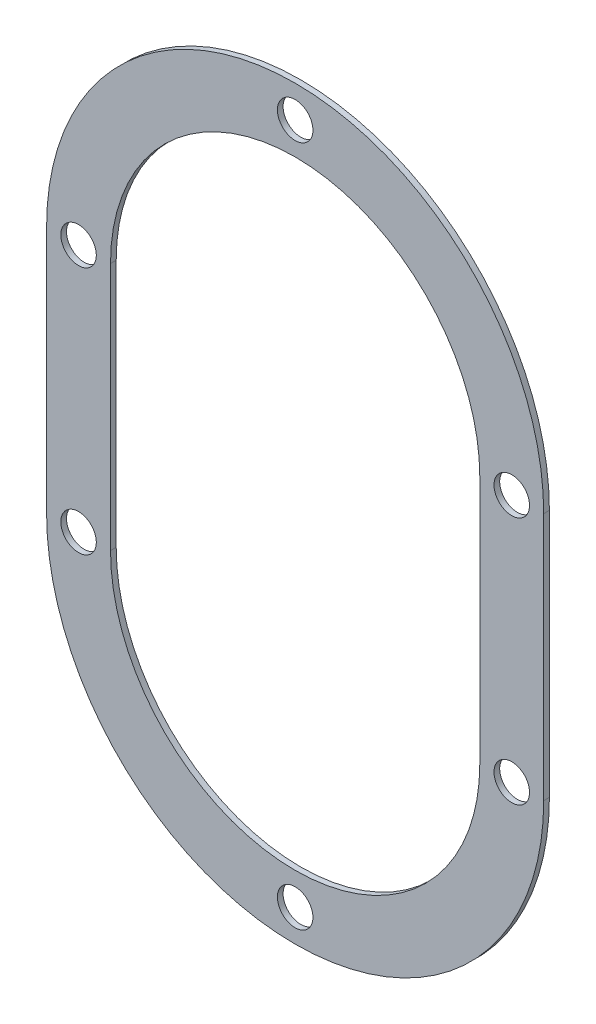
ISO-10303-21;
HEADER;
FILE_DESCRIPTION(('STEP AP214'),'2;1');
FILE_NAME('part.step','',(''),(''),'','','');
FILE_SCHEMA(('AUTOMOTIVE_DESIGN { 1 0 10303 214 1 1 1 1 }'));
ENDSEC;
DATA;
#1=APPLICATION_CONTEXT('core data for automotive mechanical design processes');
#2=APPLICATION_PROTOCOL_DEFINITION('international standard','automotive_design',2000,#1);
#3=PRODUCT_CONTEXT('',#1,'mechanical');
#4=PRODUCT('Part','Part','',(#3));
#5=PRODUCT_RELATED_PRODUCT_CATEGORY('part','',(#4));
#6=PRODUCT_DEFINITION_FORMATION('','',#4);
#7=PRODUCT_DEFINITION_CONTEXT('part definition',#1,'design');
#8=PRODUCT_DEFINITION('design','',#6,#7);
#9=PRODUCT_DEFINITION_SHAPE('','',#8);
#10=(LENGTH_UNIT() NAMED_UNIT(*) SI_UNIT(.MILLI.,.METRE.));
#11=(NAMED_UNIT(*) PLANE_ANGLE_UNIT() SI_UNIT($,.RADIAN.));
#12=(NAMED_UNIT(*) SI_UNIT($,.STERADIAN.) SOLID_ANGLE_UNIT());
#13=UNCERTAINTY_MEASURE_WITH_UNIT(LENGTH_MEASURE(1.E-05),#10,'distance_accuracy_value','');
#14=(GEOMETRIC_REPRESENTATION_CONTEXT(3) GLOBAL_UNCERTAINTY_ASSIGNED_CONTEXT((#13)) GLOBAL_UNIT_ASSIGNED_CONTEXT((#10,
#11,#12)) REPRESENTATION_CONTEXT('',''));
#15=CARTESIAN_POINT('',(0.,0.,0.));
#16=DIRECTION('',(0.,0.,1.));
#17=DIRECTION('',(1.,0.,0.));
#18=AXIS2_PLACEMENT_3D('',#15,#16,#17);
#19=CARTESIAN_POINT('',(0.,0.,0.8));
#20=DIRECTION('',(0.,0.,1.));
#21=DIRECTION('',(1.,0.,0.));
#22=AXIS2_PLACEMENT_3D('',#19,#20,#21);
#23=PLANE('',#22);
#24=CARTESIAN_POINT('',(-30.5,-35.,0.8));
#25=DIRECTION('',(0.,0.,1.));
#26=DIRECTION('',(1.,0.,0.));
#27=AXIS2_PLACEMENT_3D('',#24,#25,#26);
#28=CIRCLE('',#27,2.5);
#29=CARTESIAN_POINT('',(-28.,-35.,0.8));
#30=VERTEX_POINT('',#29);
#31=EDGE_CURVE('E257',#30,#30,#28,.T.);
#32=ORIENTED_EDGE('',*,*,#31,.F.);
#33=EDGE_LOOP('',(#32));
#34=FACE_BOUND('',#33,.T.);
#35=CARTESIAN_POINT('',(30.5,0.,0.8));
#36=DIRECTION('',(0.,0.,1.));
#37=DIRECTION('',(1.,0.,0.));
#38=AXIS2_PLACEMENT_3D('',#35,#36,#37);
#39=CIRCLE('',#38,2.5);
#40=CARTESIAN_POINT('',(33.,0.,0.8));
#41=VERTEX_POINT('',#40);
#42=EDGE_CURVE('E269',#41,#41,#39,.T.);
#43=ORIENTED_EDGE('',*,*,#42,.F.);
#44=EDGE_LOOP('',(#43));
#45=FACE_BOUND('',#44,.T.);
#46=CARTESIAN_POINT('',(-30.5,0.,0.8));
#47=DIRECTION('',(0.,0.,1.));
#48=DIRECTION('',(1.,0.,0.));
#49=AXIS2_PLACEMENT_3D('',#46,#47,#48);
#50=CIRCLE('',#49,2.5);
#51=CARTESIAN_POINT('',(-28.,0.,0.8));
#52=VERTEX_POINT('',#51);
#53=EDGE_CURVE('E131',#52,#52,#50,.T.);
#54=ORIENTED_EDGE('',*,*,#53,.F.);
#55=EDGE_LOOP('',(#54));
#56=FACE_BOUND('',#55,.T.);
#57=CARTESIAN_POINT('',(0.,0.,0.8));
#58=DIRECTION('',(0.,0.,1.));
#59=DIRECTION('',(1.,0.,0.));
#60=AXIS2_PLACEMENT_3D('',#57,#58,#59);
#61=CIRCLE('',#60,35.);
#62=CARTESIAN_POINT('',(35.,0.,0.8));
#63=VERTEX_POINT('',#62);
#64=CARTESIAN_POINT('',(-35.,0.,0.8));
#65=VERTEX_POINT('',#64);
#66=EDGE_CURVE('E141',#63,#65,#61,.T.);
#67=ORIENTED_EDGE('',*,*,#66,.T.);
#68=DIRECTION('',(0.,-1.,0.));
#69=VECTOR('',#68,1.);
#70=CARTESIAN_POINT('',(-35.,0.,0.8));
#71=LINE('',#70,#69);
#72=CARTESIAN_POINT('',(-35.,-35.,0.8));
#73=VERTEX_POINT('',#72);
#74=EDGE_CURVE('E144',#65,#73,#71,.T.);
#75=ORIENTED_EDGE('',*,*,#74,.T.);
#76=CARTESIAN_POINT('',(0.,-35.,0.8));
#77=DIRECTION('',(0.,0.,1.));
#78=DIRECTION('',(1.,0.,0.));
#79=AXIS2_PLACEMENT_3D('',#76,#77,#78);
#80=CIRCLE('',#79,35.);
#81=CARTESIAN_POINT('',(35.,-35.,0.8));
#82=VERTEX_POINT('',#81);
#83=EDGE_CURVE('E147',#73,#82,#80,.T.);
#84=ORIENTED_EDGE('',*,*,#83,.T.);
#85=DIRECTION('',(0.,1.,0.));
#86=VECTOR('',#85,1.);
#87=CARTESIAN_POINT('',(35.,0.,0.8));
#88=LINE('',#87,#86);
#89=EDGE_CURVE('E149',#82,#63,#88,.T.);
#90=ORIENTED_EDGE('',*,*,#89,.T.);
#91=EDGE_LOOP('',(#67,#75,#84,#90));
#92=FACE_BOUND('',#91,.T.);
#93=DIRECTION('',(0.,-1.,0.));
#94=VECTOR('',#93,1.);
#95=CARTESIAN_POINT('',(-26.,0.,0.8));
#96=LINE('',#95,#94);
#97=CARTESIAN_POINT('',(-26.,0.,0.8));
#98=VERTEX_POINT('',#97);
#99=CARTESIAN_POINT('',(-26.,-35.,0.8));
#100=VERTEX_POINT('',#99);
#101=EDGE_CURVE('E110',#98,#100,#96,.T.);
#102=ORIENTED_EDGE('',*,*,#101,.F.);
#103=CARTESIAN_POINT('',(0.,0.,0.8));
#104=DIRECTION('',(0.,0.,1.));
#105=DIRECTION('',(1.,0.,0.));
#106=AXIS2_PLACEMENT_3D('',#103,#104,#105);
#107=CIRCLE('',#106,26.);
#108=CARTESIAN_POINT('',(26.,0.,0.8));
#109=VERTEX_POINT('',#108);
#110=EDGE_CURVE('E102',#109,#98,#107,.T.);
#111=ORIENTED_EDGE('',*,*,#110,.F.);
#112=DIRECTION('',(0.,1.,0.));
#113=VECTOR('',#112,1.);
#114=CARTESIAN_POINT('',(26.,0.,0.8));
#115=LINE('',#114,#113);
#116=CARTESIAN_POINT('',(26.,-35.,0.8));
#117=VERTEX_POINT('',#116);
#118=EDGE_CURVE('E125',#117,#109,#115,.T.);
#119=ORIENTED_EDGE('',*,*,#118,.F.);
#120=CARTESIAN_POINT('',(0.,-35.,0.8));
#121=DIRECTION('',(0.,0.,1.));
#122=DIRECTION('',(1.,0.,0.));
#123=AXIS2_PLACEMENT_3D('',#120,#121,#122);
#124=CIRCLE('',#123,26.);
#125=EDGE_CURVE('E123',#100,#117,#124,.T.);
#126=ORIENTED_EDGE('',*,*,#125,.F.);
#127=EDGE_LOOP('',(#102,#111,#119,#126));
#128=FACE_BOUND('',#127,.T.);
#129=CARTESIAN_POINT('',(0.,30.5,0.8));
#130=DIRECTION('',(0.,0.,1.));
#131=DIRECTION('',(1.,0.,0.));
#132=AXIS2_PLACEMENT_3D('',#129,#130,#131);
#133=CIRCLE('',#132,2.5);
#134=CARTESIAN_POINT('',(2.5,30.5,0.8));
#135=VERTEX_POINT('',#134);
#136=EDGE_CURVE('E275',#135,#135,#133,.T.);
#137=ORIENTED_EDGE('',*,*,#136,.F.);
#138=EDGE_LOOP('',(#137));
#139=FACE_BOUND('',#138,.T.);
#140=CARTESIAN_POINT('',(0.,-65.5,0.8));
#141=DIRECTION('',(0.,0.,1.));
#142=DIRECTION('',(1.,0.,0.));
#143=AXIS2_PLACEMENT_3D('',#140,#141,#142);
#144=CIRCLE('',#143,2.5);
#145=CARTESIAN_POINT('',(2.5,-65.5,0.8));
#146=VERTEX_POINT('',#145);
#147=EDGE_CURVE('E263',#146,#146,#144,.T.);
#148=ORIENTED_EDGE('',*,*,#147,.F.);
#149=EDGE_LOOP('',(#148));
#150=FACE_BOUND('',#149,.T.);
#151=CARTESIAN_POINT('',(30.5,-35.,0.8));
#152=DIRECTION('',(0.,0.,1.));
#153=DIRECTION('',(1.,0.,0.));
#154=AXIS2_PLACEMENT_3D('',#151,#152,#153);
#155=CIRCLE('',#154,2.5);
#156=CARTESIAN_POINT('',(33.,-35.,0.8));
#157=VERTEX_POINT('',#156);
#158=EDGE_CURVE('E248',#157,#157,#155,.T.);
#159=ORIENTED_EDGE('',*,*,#158,.F.);
#160=EDGE_LOOP('',(#159));
#161=FACE_BOUND('',#160,.T.);
#162=ADVANCED_FACE('F37',(#34,#45,#56,#92,#128,#139,#150,#161),#23,.T.);
#163=CARTESIAN_POINT('',(0.,0.,0.));
#164=DIRECTION('',(0.,0.,1.));
#165=DIRECTION('',(1.,0.,0.));
#166=AXIS2_PLACEMENT_3D('',#163,#164,#165);
#167=PLANE('',#166);
#168=CARTESIAN_POINT('',(0.,0.,0.));
#169=DIRECTION('',(0.,0.,1.));
#170=DIRECTION('',(1.,0.,0.));
#171=AXIS2_PLACEMENT_3D('',#168,#169,#170);
#172=CIRCLE('',#171,35.);
#173=CARTESIAN_POINT('',(35.,0.,0.));
#174=VERTEX_POINT('',#173);
#175=CARTESIAN_POINT('',(-35.,0.,0.));
#176=VERTEX_POINT('',#175);
#177=EDGE_CURVE('E118',#174,#176,#172,.T.);
#178=ORIENTED_EDGE('',*,*,#177,.F.);
#179=DIRECTION('',(0.,1.,0.));
#180=VECTOR('',#179,1.);
#181=CARTESIAN_POINT('',(35.,0.,0.));
#182=LINE('',#181,#180);
#183=CARTESIAN_POINT('',(35.,-35.,0.));
#184=VERTEX_POINT('',#183);
#185=EDGE_CURVE('E145',#184,#174,#182,.T.);
#186=ORIENTED_EDGE('',*,*,#185,.F.);
#187=CARTESIAN_POINT('',(0.,-35.,0.));
#188=DIRECTION('',(0.,0.,1.));
#189=DIRECTION('',(1.,0.,0.));
#190=AXIS2_PLACEMENT_3D('',#187,#188,#189);
#191=CIRCLE('',#190,35.);
#192=CARTESIAN_POINT('',(-35.,-35.,0.));
#193=VERTEX_POINT('',#192);
#194=EDGE_CURVE('E156',#193,#184,#191,.T.);
#195=ORIENTED_EDGE('',*,*,#194,.F.);
#196=DIRECTION('',(0.,-1.,0.));
#197=VECTOR('',#196,1.);
#198=CARTESIAN_POINT('',(-35.,0.,0.));
#199=LINE('',#198,#197);
#200=EDGE_CURVE('E154',#176,#193,#199,.T.);
#201=ORIENTED_EDGE('',*,*,#200,.F.);
#202=EDGE_LOOP('',(#178,#186,#195,#201));
#203=FACE_BOUND('',#202,.T.);
#204=CARTESIAN_POINT('',(0.,0.,0.));
#205=DIRECTION('',(0.,0.,1.));
#206=DIRECTION('',(1.,0.,0.));
#207=AXIS2_PLACEMENT_3D('',#204,#205,#206);
#208=CIRCLE('',#207,26.);
#209=CARTESIAN_POINT('',(26.,0.,0.));
#210=VERTEX_POINT('',#209);
#211=CARTESIAN_POINT('',(-26.,0.,0.));
#212=VERTEX_POINT('',#211);
#213=EDGE_CURVE('E60',#210,#212,#208,.T.);
#214=ORIENTED_EDGE('',*,*,#213,.T.);
#215=DIRECTION('',(0.,-1.,0.));
#216=VECTOR('',#215,1.);
#217=CARTESIAN_POINT('',(-26.,0.,0.));
#218=LINE('',#217,#216);
#219=CARTESIAN_POINT('',(-26.,-35.,0.));
#220=VERTEX_POINT('',#219);
#221=EDGE_CURVE('E117',#212,#220,#218,.T.);
#222=ORIENTED_EDGE('',*,*,#221,.T.);
#223=CARTESIAN_POINT('',(0.,-35.,0.));
#224=DIRECTION('',(0.,0.,1.));
#225=DIRECTION('',(1.,0.,0.));
#226=AXIS2_PLACEMENT_3D('',#223,#224,#225);
#227=CIRCLE('',#226,26.);
#228=CARTESIAN_POINT('',(26.,-35.,0.));
#229=VERTEX_POINT('',#228);
#230=EDGE_CURVE('E133',#220,#229,#227,.T.);
#231=ORIENTED_EDGE('',*,*,#230,.T.);
#232=DIRECTION('',(0.,1.,0.));
#233=VECTOR('',#232,1.);
#234=CARTESIAN_POINT('',(26.,0.,0.));
#235=LINE('',#234,#233);
#236=EDGE_CURVE('E111',#229,#210,#235,.T.);
#237=ORIENTED_EDGE('',*,*,#236,.T.);
#238=EDGE_LOOP('',(#214,#222,#231,#237));
#239=FACE_BOUND('',#238,.T.);
#240=CARTESIAN_POINT('',(-30.5,0.,0.));
#241=DIRECTION('',(0.,0.,1.));
#242=DIRECTION('',(1.,0.,0.));
#243=AXIS2_PLACEMENT_3D('',#240,#241,#242);
#244=CIRCLE('',#243,2.5);
#245=CARTESIAN_POINT('',(-28.,0.,0.));
#246=VERTEX_POINT('',#245);
#247=EDGE_CURVE('E278',#246,#246,#244,.T.);
#248=ORIENTED_EDGE('',*,*,#247,.T.);
#249=EDGE_LOOP('',(#248));
#250=FACE_BOUND('',#249,.T.);
#251=CARTESIAN_POINT('',(0.,30.5,0.));
#252=DIRECTION('',(0.,0.,1.));
#253=DIRECTION('',(1.,0.,0.));
#254=AXIS2_PLACEMENT_3D('',#251,#252,#253);
#255=CIRCLE('',#254,2.5);
#256=CARTESIAN_POINT('',(2.5,30.5,0.));
#257=VERTEX_POINT('',#256);
#258=EDGE_CURVE('E272',#257,#257,#255,.T.);
#259=ORIENTED_EDGE('',*,*,#258,.T.);
#260=EDGE_LOOP('',(#259));
#261=FACE_BOUND('',#260,.T.);
#262=CARTESIAN_POINT('',(30.5,0.,0.));
#263=DIRECTION('',(0.,0.,1.));
#264=DIRECTION('',(1.,0.,0.));
#265=AXIS2_PLACEMENT_3D('',#262,#263,#264);
#266=CIRCLE('',#265,2.5);
#267=CARTESIAN_POINT('',(33.,0.,0.));
#268=VERTEX_POINT('',#267);
#269=EDGE_CURVE('E266',#268,#268,#266,.T.);
#270=ORIENTED_EDGE('',*,*,#269,.T.);
#271=EDGE_LOOP('',(#270));
#272=FACE_BOUND('',#271,.T.);
#273=CARTESIAN_POINT('',(0.,-65.5,0.));
#274=DIRECTION('',(0.,0.,1.));
#275=DIRECTION('',(1.,0.,0.));
#276=AXIS2_PLACEMENT_3D('',#273,#274,#275);
#277=CIRCLE('',#276,2.5);
#278=CARTESIAN_POINT('',(2.5,-65.5,0.));
#279=VERTEX_POINT('',#278);
#280=EDGE_CURVE('E260',#279,#279,#277,.T.);
#281=ORIENTED_EDGE('',*,*,#280,.T.);
#282=EDGE_LOOP('',(#281));
#283=FACE_BOUND('',#282,.T.);
#284=CARTESIAN_POINT('',(-30.5,-35.,0.));
#285=DIRECTION('',(0.,0.,1.));
#286=DIRECTION('',(1.,0.,0.));
#287=AXIS2_PLACEMENT_3D('',#284,#285,#286);
#288=CIRCLE('',#287,2.5);
#289=CARTESIAN_POINT('',(-28.,-35.,0.));
#290=VERTEX_POINT('',#289);
#291=EDGE_CURVE('E254',#290,#290,#288,.T.);
#292=ORIENTED_EDGE('',*,*,#291,.T.);
#293=EDGE_LOOP('',(#292));
#294=FACE_BOUND('',#293,.T.);
#295=CARTESIAN_POINT('',(30.5,-35.,0.));
#296=DIRECTION('',(0.,0.,1.));
#297=DIRECTION('',(1.,0.,0.));
#298=AXIS2_PLACEMENT_3D('',#295,#296,#297);
#299=CIRCLE('',#298,2.5);
#300=CARTESIAN_POINT('',(33.,-35.,0.));
#301=VERTEX_POINT('',#300);
#302=EDGE_CURVE('E251',#301,#301,#299,.T.);
#303=ORIENTED_EDGE('',*,*,#302,.T.);
#304=EDGE_LOOP('',(#303));
#305=FACE_BOUND('',#304,.T.);
#306=ADVANCED_FACE('F174',(#203,#239,#250,#261,#272,#283,#294,#305),#167,.F.);
#307=CARTESIAN_POINT('',(0.,0.,0.8));
#308=DIRECTION('',(0.,0.,-1.));
#309=DIRECTION('',(-1.,0.,0.));
#310=AXIS2_PLACEMENT_3D('',#307,#308,#309);
#311=CYLINDRICAL_SURFACE('',#310,35.);
#312=ORIENTED_EDGE('',*,*,#177,.T.);
#313=DIRECTION('',(0.,0.,-1.));
#314=VECTOR('',#313,1.);
#315=CARTESIAN_POINT('',(-35.,0.,0.8));
#316=LINE('',#315,#314);
#317=EDGE_CURVE('E11',#65,#176,#316,.T.);
#318=ORIENTED_EDGE('',*,*,#317,.F.);
#319=ORIENTED_EDGE('',*,*,#66,.F.);
#320=DIRECTION('',(0.,0.,-1.));
#321=VECTOR('',#320,1.);
#322=CARTESIAN_POINT('',(35.,0.,0.8));
#323=LINE('',#322,#321);
#324=EDGE_CURVE('E151',#63,#174,#323,.T.);
#325=ORIENTED_EDGE('',*,*,#324,.T.);
#326=EDGE_LOOP('',(#312,#318,#319,#325));
#327=FACE_BOUND('',#326,.T.);
#328=ADVANCED_FACE('F39',(#327),#311,.T.);
#329=CARTESIAN_POINT('',(-35.,0.,0.8));
#330=DIRECTION('',(1.,0.,0.));
#331=DIRECTION('',(0.,1.,0.));
#332=AXIS2_PLACEMENT_3D('',#329,#330,#331);
#333=PLANE('',#332);
#334=ORIENTED_EDGE('',*,*,#200,.T.);
#335=DIRECTION('',(0.,0.,-1.));
#336=VECTOR('',#335,1.);
#337=CARTESIAN_POINT('',(-35.,-35.,0.8));
#338=LINE('',#337,#336);
#339=EDGE_CURVE('E45',#73,#193,#338,.T.);
#340=ORIENTED_EDGE('',*,*,#339,.F.);
#341=ORIENTED_EDGE('',*,*,#74,.F.);
#342=ORIENTED_EDGE('',*,*,#317,.T.);
#343=EDGE_LOOP('',(#334,#340,#341,#342));
#344=FACE_BOUND('',#343,.T.);
#345=ADVANCED_FACE('F184',(#344),#333,.F.);
#346=CARTESIAN_POINT('',(0.,-35.,0.8));
#347=DIRECTION('',(0.,0.,-1.));
#348=DIRECTION('',(-1.,0.,0.));
#349=AXIS2_PLACEMENT_3D('',#346,#347,#348);
#350=CYLINDRICAL_SURFACE('',#349,35.);
#351=ORIENTED_EDGE('',*,*,#194,.T.);
#352=DIRECTION('',(0.,0.,-1.));
#353=VECTOR('',#352,1.);
#354=CARTESIAN_POINT('',(35.,-35.,0.8));
#355=LINE('',#354,#353);
#356=EDGE_CURVE('E161',#82,#184,#355,.T.);
#357=ORIENTED_EDGE('',*,*,#356,.F.);
#358=ORIENTED_EDGE('',*,*,#83,.F.);
#359=ORIENTED_EDGE('',*,*,#339,.T.);
#360=EDGE_LOOP('',(#351,#357,#358,#359));
#361=FACE_BOUND('',#360,.T.);
#362=ADVANCED_FACE('F168',(#361),#350,.T.);
#363=CARTESIAN_POINT('',(35.,0.,0.8));
#364=DIRECTION('',(-1.,0.,0.));
#365=DIRECTION('',(0.,-1.,0.));
#366=AXIS2_PLACEMENT_3D('',#363,#364,#365);
#367=PLANE('',#366);
#368=ORIENTED_EDGE('',*,*,#185,.T.);
#369=ORIENTED_EDGE('',*,*,#324,.F.);
#370=ORIENTED_EDGE('',*,*,#89,.F.);
#371=ORIENTED_EDGE('',*,*,#356,.T.);
#372=EDGE_LOOP('',(#368,#369,#370,#371));
#373=FACE_BOUND('',#372,.T.);
#374=ADVANCED_FACE('F178',(#373),#367,.F.);
#375=CARTESIAN_POINT('',(0.,0.,0.8));
#376=DIRECTION('',(0.,0.,-1.));
#377=DIRECTION('',(-1.,0.,0.));
#378=AXIS2_PLACEMENT_3D('',#375,#376,#377);
#379=CYLINDRICAL_SURFACE('',#378,26.);
#380=ORIENTED_EDGE('',*,*,#213,.F.);
#381=DIRECTION('',(0.,0.,-1.));
#382=VECTOR('',#381,1.);
#383=CARTESIAN_POINT('',(26.,0.,0.8));
#384=LINE('',#383,#382);
#385=EDGE_CURVE('E106',#109,#210,#384,.T.);
#386=ORIENTED_EDGE('',*,*,#385,.F.);
#387=ORIENTED_EDGE('',*,*,#110,.T.);
#388=DIRECTION('',(0.,0.,-1.));
#389=VECTOR('',#388,1.);
#390=CARTESIAN_POINT('',(-26.,0.,0.8));
#391=LINE('',#390,#389);
#392=EDGE_CURVE('E105',#98,#212,#391,.T.);
#393=ORIENTED_EDGE('',*,*,#392,.T.);
#394=EDGE_LOOP('',(#380,#386,#387,#393));
#395=FACE_BOUND('',#394,.T.);
#396=ADVANCED_FACE('F104',(#395),#379,.F.);
#397=CARTESIAN_POINT('',(-26.,0.,0.8));
#398=DIRECTION('',(1.,0.,0.));
#399=DIRECTION('',(0.,0.,-1.));
#400=AXIS2_PLACEMENT_3D('',#397,#398,#399);
#401=PLANE('',#400);
#402=ORIENTED_EDGE('',*,*,#221,.F.);
#403=ORIENTED_EDGE('',*,*,#392,.F.);
#404=ORIENTED_EDGE('',*,*,#101,.T.);
#405=DIRECTION('',(0.,0.,-1.));
#406=VECTOR('',#405,1.);
#407=CARTESIAN_POINT('',(-26.,-35.,0.8));
#408=LINE('',#407,#406);
#409=EDGE_CURVE('E119',#100,#220,#408,.T.);
#410=ORIENTED_EDGE('',*,*,#409,.T.);
#411=EDGE_LOOP('',(#402,#403,#404,#410));
#412=FACE_BOUND('',#411,.T.);
#413=ADVANCED_FACE('F114',(#412),#401,.T.);
#414=CARTESIAN_POINT('',(0.,-35.,0.8));
#415=DIRECTION('',(0.,0.,-1.));
#416=DIRECTION('',(-1.,0.,0.));
#417=AXIS2_PLACEMENT_3D('',#414,#415,#416);
#418=CYLINDRICAL_SURFACE('',#417,26.);
#419=ORIENTED_EDGE('',*,*,#230,.F.);
#420=ORIENTED_EDGE('',*,*,#409,.F.);
#421=ORIENTED_EDGE('',*,*,#125,.T.);
#422=DIRECTION('',(0.,0.,-1.));
#423=VECTOR('',#422,1.);
#424=CARTESIAN_POINT('',(26.,-35.,0.8));
#425=LINE('',#424,#423);
#426=EDGE_CURVE('E52',#117,#229,#425,.T.);
#427=ORIENTED_EDGE('',*,*,#426,.T.);
#428=EDGE_LOOP('',(#419,#420,#421,#427));
#429=FACE_BOUND('',#428,.T.);
#430=ADVANCED_FACE('F210',(#429),#418,.F.);
#431=CARTESIAN_POINT('',(26.,0.,0.8));
#432=DIRECTION('',(-1.,0.,0.));
#433=DIRECTION('',(0.,-1.,0.));
#434=AXIS2_PLACEMENT_3D('',#431,#432,#433);
#435=PLANE('',#434);
#436=ORIENTED_EDGE('',*,*,#236,.F.);
#437=ORIENTED_EDGE('',*,*,#426,.F.);
#438=ORIENTED_EDGE('',*,*,#118,.T.);
#439=ORIENTED_EDGE('',*,*,#385,.T.);
#440=EDGE_LOOP('',(#436,#437,#438,#439));
#441=FACE_BOUND('',#440,.T.);
#442=ADVANCED_FACE('F214',(#441),#435,.T.);
#443=CARTESIAN_POINT('',(-30.5,0.,0.8));
#444=DIRECTION('',(0.,0.,-1.));
#445=DIRECTION('',(-1.,0.,0.));
#446=AXIS2_PLACEMENT_3D('',#443,#444,#445);
#447=CYLINDRICAL_SURFACE('',#446,2.5);
#448=ORIENTED_EDGE('',*,*,#53,.T.);
#449=EDGE_LOOP('',(#448));
#450=FACE_BOUND('',#449,.T.);
#451=ORIENTED_EDGE('',*,*,#247,.F.);
#452=EDGE_LOOP('',(#451));
#453=FACE_BOUND('',#452,.T.);
#454=ADVANCED_FACE('F220',(#450,#453),#447,.F.);
#455=CARTESIAN_POINT('',(0.,30.5,0.8));
#456=DIRECTION('',(0.,0.,-1.));
#457=DIRECTION('',(-1.,0.,0.));
#458=AXIS2_PLACEMENT_3D('',#455,#456,#457);
#459=CYLINDRICAL_SURFACE('',#458,2.5);
#460=ORIENTED_EDGE('',*,*,#136,.T.);
#461=EDGE_LOOP('',(#460));
#462=FACE_BOUND('',#461,.T.);
#463=ORIENTED_EDGE('',*,*,#258,.F.);
#464=EDGE_LOOP('',(#463));
#465=FACE_BOUND('',#464,.T.);
#466=ADVANCED_FACE('F223',(#462,#465),#459,.F.);
#467=CARTESIAN_POINT('',(30.5,0.,0.8));
#468=DIRECTION('',(0.,0.,-1.));
#469=DIRECTION('',(-1.,0.,0.));
#470=AXIS2_PLACEMENT_3D('',#467,#468,#469);
#471=CYLINDRICAL_SURFACE('',#470,2.5);
#472=ORIENTED_EDGE('',*,*,#42,.T.);
#473=EDGE_LOOP('',(#472));
#474=FACE_BOUND('',#473,.T.);
#475=ORIENTED_EDGE('',*,*,#269,.F.);
#476=EDGE_LOOP('',(#475));
#477=FACE_BOUND('',#476,.T.);
#478=ADVANCED_FACE('F227',(#474,#477),#471,.F.);
#479=CARTESIAN_POINT('',(0.,-65.5,0.8));
#480=DIRECTION('',(0.,0.,-1.));
#481=DIRECTION('',(-1.,0.,0.));
#482=AXIS2_PLACEMENT_3D('',#479,#480,#481);
#483=CYLINDRICAL_SURFACE('',#482,2.5);
#484=ORIENTED_EDGE('',*,*,#147,.T.);
#485=EDGE_LOOP('',(#484));
#486=FACE_BOUND('',#485,.T.);
#487=ORIENTED_EDGE('',*,*,#280,.F.);
#488=EDGE_LOOP('',(#487));
#489=FACE_BOUND('',#488,.T.);
#490=ADVANCED_FACE('F231',(#486,#489),#483,.F.);
#491=CARTESIAN_POINT('',(-30.5,-35.,0.8));
#492=DIRECTION('',(0.,0.,-1.));
#493=DIRECTION('',(-1.,0.,0.));
#494=AXIS2_PLACEMENT_3D('',#491,#492,#493);
#495=CYLINDRICAL_SURFACE('',#494,2.5);
#496=ORIENTED_EDGE('',*,*,#31,.T.);
#497=EDGE_LOOP('',(#496));
#498=FACE_BOUND('',#497,.T.);
#499=ORIENTED_EDGE('',*,*,#291,.F.);
#500=EDGE_LOOP('',(#499));
#501=FACE_BOUND('',#500,.T.);
#502=ADVANCED_FACE('F235',(#498,#501),#495,.F.);
#503=CARTESIAN_POINT('',(30.5,-35.,0.8));
#504=DIRECTION('',(0.,0.,-1.));
#505=DIRECTION('',(-1.,0.,0.));
#506=AXIS2_PLACEMENT_3D('',#503,#504,#505);
#507=CYLINDRICAL_SURFACE('',#506,2.5);
#508=ORIENTED_EDGE('',*,*,#158,.T.);
#509=EDGE_LOOP('',(#508));
#510=FACE_BOUND('',#509,.T.);
#511=ORIENTED_EDGE('',*,*,#302,.F.);
#512=EDGE_LOOP('',(#511));
#513=FACE_BOUND('',#512,.T.);
#514=ADVANCED_FACE('F239',(#510,#513),#507,.F.);
#515=CLOSED_SHELL('',(#162,#306,#328,#345,#362,#374,#396,#413,#430,#442,#454,#466,#478,#490,
#502,#514));
#516=MANIFOLD_SOLID_BREP('B2',#515);
#517=ADVANCED_BREP_SHAPE_REPRESENTATION('',(#18,#516),#14);
#518=SHAPE_DEFINITION_REPRESENTATION(#9,#517);
ENDSEC;
END-ISO-10303-21;
